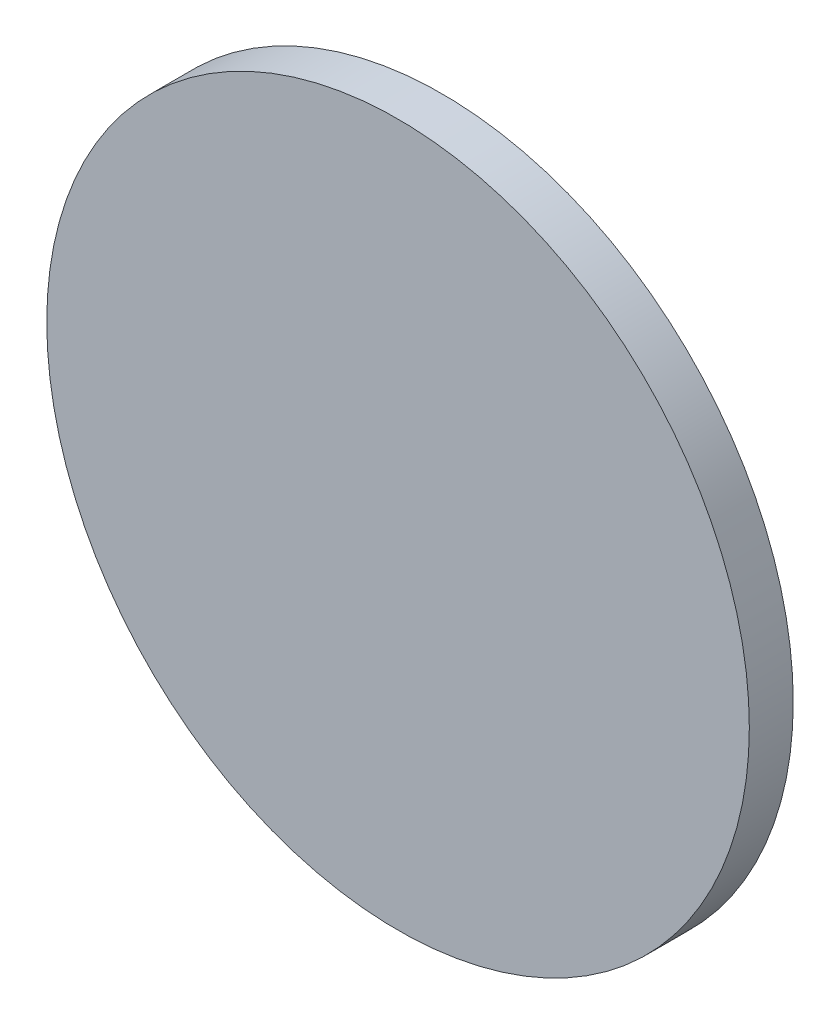
ISO-10303-21;
HEADER;
FILE_DESCRIPTION(('STEP AP214'),'2;1');
FILE_NAME('part.step','',(''),(''),'','','');
FILE_SCHEMA(('AUTOMOTIVE_DESIGN { 1 0 10303 214 1 1 1 1 }'));
ENDSEC;
DATA;
#1=APPLICATION_CONTEXT('core data for automotive mechanical design processes');
#2=APPLICATION_PROTOCOL_DEFINITION('international standard','automotive_design',2000,#1);
#3=PRODUCT_CONTEXT('',#1,'mechanical');
#4=PRODUCT('Part','Part','',(#3));
#5=PRODUCT_RELATED_PRODUCT_CATEGORY('part','',(#4));
#6=PRODUCT_DEFINITION_FORMATION('','',#4);
#7=PRODUCT_DEFINITION_CONTEXT('part definition',#1,'design');
#8=PRODUCT_DEFINITION('design','',#6,#7);
#9=PRODUCT_DEFINITION_SHAPE('','',#8);
#10=(LENGTH_UNIT() NAMED_UNIT(*) SI_UNIT(.MILLI.,.METRE.));
#11=(NAMED_UNIT(*) PLANE_ANGLE_UNIT() SI_UNIT($,.RADIAN.));
#12=(NAMED_UNIT(*) SI_UNIT($,.STERADIAN.) SOLID_ANGLE_UNIT());
#13=UNCERTAINTY_MEASURE_WITH_UNIT(LENGTH_MEASURE(1.E-05),#10,'distance_accuracy_value','');
#14=(GEOMETRIC_REPRESENTATION_CONTEXT(3) GLOBAL_UNCERTAINTY_ASSIGNED_CONTEXT((#13)) GLOBAL_UNIT_ASSIGNED_CONTEXT((#10,
#11,#12)) REPRESENTATION_CONTEXT('',''));
#15=CARTESIAN_POINT('',(0.,0.,0.));
#16=DIRECTION('',(0.,0.,1.));
#17=DIRECTION('',(1.,0.,0.));
#18=AXIS2_PLACEMENT_3D('',#15,#16,#17);
#19=CARTESIAN_POINT('',(0.,0.759664545437467,5.));
#20=DIRECTION('',(0.,0.,-1.));
#21=DIRECTION('',(-1.,0.,0.));
#22=AXIS2_PLACEMENT_3D('',#19,#20,#21);
#23=CYLINDRICAL_SURFACE('',#22,40.);
#24=CARTESIAN_POINT('',(0.,0.759664545437467,5.));
#25=DIRECTION('',(0.,0.,1.));
#26=DIRECTION('',(1.,0.,0.));
#27=AXIS2_PLACEMENT_3D('',#24,#25,#26);
#28=CIRCLE('',#27,40.);
#29=CARTESIAN_POINT('',(40.,0.759664545437467,5.));
#30=VERTEX_POINT('',#29);
#31=EDGE_CURVE('E11',#30,#30,#28,.T.);
#32=ORIENTED_EDGE('',*,*,#31,.F.);
#33=EDGE_LOOP('',(#32));
#34=FACE_BOUND('',#33,.T.);
#35=CARTESIAN_POINT('',(0.,0.759664545437467,0.));
#36=DIRECTION('',(0.,0.,1.));
#37=DIRECTION('',(1.,0.,0.));
#38=AXIS2_PLACEMENT_3D('',#35,#36,#37);
#39=CIRCLE('',#38,40.);
#40=CARTESIAN_POINT('',(40.,0.759664545437467,0.));
#41=VERTEX_POINT('',#40);
#42=EDGE_CURVE('E72',#41,#41,#39,.T.);
#43=ORIENTED_EDGE('',*,*,#42,.T.);
#44=EDGE_LOOP('',(#43));
#45=FACE_BOUND('',#44,.T.);
#46=ADVANCED_FACE('F69',(#34,#45),#23,.T.);
#47=CARTESIAN_POINT('',(0.,0.759664545437467,5.));
#48=DIRECTION('',(0.,0.,1.));
#49=DIRECTION('',(1.,0.,0.));
#50=AXIS2_PLACEMENT_3D('',#47,#48,#49);
#51=PLANE('',#50);
#52=ORIENTED_EDGE('',*,*,#31,.T.);
#53=EDGE_LOOP('',(#52));
#54=FACE_BOUND('',#53,.T.);
#55=ADVANCED_FACE('F124',(#54),#51,.T.);
#56=CARTESIAN_POINT('',(0.,0.759664545437467,0.));
#57=DIRECTION('',(0.,0.,1.));
#58=DIRECTION('',(1.,0.,0.));
#59=AXIS2_PLACEMENT_3D('',#56,#57,#58);
#60=PLANE('',#59);
#61=CARTESIAN_POINT('',(0.,0.759664545437467,0.));
#62=DIRECTION('',(0.,0.,1.));
#63=DIRECTION('',(1.,0.,0.));
#64=AXIS2_PLACEMENT_3D('',#61,#62,#63);
#65=CIRCLE('',#64,36.75);
#66=CARTESIAN_POINT('',(36.75,0.759664545437467,0.));
#67=VERTEX_POINT('',#66);
#68=EDGE_CURVE('E81',#67,#67,#65,.T.);
#69=ORIENTED_EDGE('',*,*,#68,.T.);
#70=EDGE_LOOP('',(#69));
#71=FACE_BOUND('',#70,.T.);
#72=ORIENTED_EDGE('',*,*,#42,.F.);
#73=EDGE_LOOP('',(#72));
#74=FACE_BOUND('',#73,.T.);
#75=ADVANCED_FACE('F129',(#71,#74),#60,.F.);
#76=CARTESIAN_POINT('',(0.,0.759664545437467,2.));
#77=DIRECTION('',(0.,0.,1.));
#78=DIRECTION('',(1.,0.,0.));
#79=AXIS2_PLACEMENT_3D('',#76,#77,#78);
#80=PLANE('',#79);
#81=CARTESIAN_POINT('',(0.,0.759664545437467,2.));
#82=DIRECTION('',(0.,0.,1.));
#83=DIRECTION('',(1.,0.,0.));
#84=AXIS2_PLACEMENT_3D('',#81,#82,#83);
#85=CIRCLE('',#84,36.75);
#86=CARTESIAN_POINT('',(36.75,0.759664545437467,2.));
#87=VERTEX_POINT('',#86);
#88=EDGE_CURVE('E79',#87,#87,#85,.T.);
#89=ORIENTED_EDGE('',*,*,#88,.F.);
#90=EDGE_LOOP('',(#89));
#91=FACE_BOUND('',#90,.T.);
#92=CARTESIAN_POINT('',(0.,0.,2.));
#93=DIRECTION('',(0.,0.,1.));
#94=DIRECTION('',(1.,0.,0.));
#95=AXIS2_PLACEMENT_3D('',#92,#93,#94);
#96=CIRCLE('',#95,29.25);
#97=CARTESIAN_POINT('',(29.25,0.,2.));
#98=VERTEX_POINT('',#97);
#99=EDGE_CURVE('E84',#98,#98,#96,.T.);
#100=ORIENTED_EDGE('',*,*,#99,.T.);
#101=EDGE_LOOP('',(#100));
#102=FACE_BOUND('',#101,.T.);
#103=ADVANCED_FACE('F135',(#91,#102),#80,.F.);
#104=CARTESIAN_POINT('',(0.,0.759664545437467,2.));
#105=DIRECTION('',(0.,0.,-1.));
#106=DIRECTION('',(-1.,0.,0.));
#107=AXIS2_PLACEMENT_3D('',#104,#105,#106);
#108=CYLINDRICAL_SURFACE('',#107,36.75);
#109=ORIENTED_EDGE('',*,*,#88,.T.);
#110=EDGE_LOOP('',(#109));
#111=FACE_BOUND('',#110,.T.);
#112=ORIENTED_EDGE('',*,*,#68,.F.);
#113=EDGE_LOOP('',(#112));
#114=FACE_BOUND('',#113,.T.);
#115=ADVANCED_FACE('F140',(#111,#114),#108,.F.);
#116=CARTESIAN_POINT('',(0.,0.,2.));
#117=DIRECTION('',(0.,0.,-1.));
#118=DIRECTION('',(-1.,0.,0.));
#119=AXIS2_PLACEMENT_3D('',#116,#117,#118);
#120=CYLINDRICAL_SURFACE('',#119,29.25);
#121=ORIENTED_EDGE('',*,*,#99,.F.);
#122=EDGE_LOOP('',(#121));
#123=FACE_BOUND('',#122,.T.);
#124=CARTESIAN_POINT('',(0.,0.,0.));
#125=DIRECTION('',(0.,0.,1.));
#126=DIRECTION('',(1.,0.,0.));
#127=AXIS2_PLACEMENT_3D('',#124,#125,#126);
#128=CIRCLE('',#127,29.25);
#129=CARTESIAN_POINT('',(29.25,0.,0.));
#130=VERTEX_POINT('',#129);
#131=EDGE_CURVE('E87',#130,#130,#128,.T.);
#132=ORIENTED_EDGE('',*,*,#131,.T.);
#133=EDGE_LOOP('',(#132));
#134=FACE_BOUND('',#133,.T.);
#135=ADVANCED_FACE('F146',(#123,#134),#120,.T.);
#136=CARTESIAN_POINT('',(0.,0.,0.));
#137=DIRECTION('',(0.,0.,1.));
#138=DIRECTION('',(1.,0.,0.));
#139=AXIS2_PLACEMENT_3D('',#136,#137,#138);
#140=CIRCLE('',#139,24.75);
#141=CARTESIAN_POINT('',(24.75,0.,0.));
#142=VERTEX_POINT('',#141);
#143=EDGE_CURVE('E96',#142,#142,#140,.T.);
#144=ORIENTED_EDGE('',*,*,#143,.T.);
#145=EDGE_LOOP('',(#144));
#146=FACE_BOUND('',#145,.T.);
#147=ORIENTED_EDGE('',*,*,#131,.F.);
#148=EDGE_LOOP('',(#147));
#149=FACE_BOUND('',#148,.T.);
#150=ADVANCED_FACE('F105',(#146,#149),#60,.F.);
#151=CARTESIAN_POINT('',(0.,0.,2.));
#152=DIRECTION('',(0.,0.,1.));
#153=DIRECTION('',(1.,0.,0.));
#154=AXIS2_PLACEMENT_3D('',#151,#152,#153);
#155=PLANE('',#154);
#156=CARTESIAN_POINT('',(0.,0.,2.));
#157=DIRECTION('',(0.,0.,1.));
#158=DIRECTION('',(1.,0.,0.));
#159=AXIS2_PLACEMENT_3D('',#156,#157,#158);
#160=CIRCLE('',#159,24.75);
#161=CARTESIAN_POINT('',(24.75,0.,2.));
#162=VERTEX_POINT('',#161);
#163=EDGE_CURVE('E99',#162,#162,#160,.T.);
#164=ORIENTED_EDGE('',*,*,#163,.F.);
#165=EDGE_LOOP('',(#164));
#166=FACE_BOUND('',#165,.T.);
#167=CARTESIAN_POINT('',(0.,0.,2.));
#168=DIRECTION('',(0.,0.,1.));
#169=DIRECTION('',(1.,0.,0.));
#170=AXIS2_PLACEMENT_3D('',#167,#168,#169);
#171=CIRCLE('',#170,23.25);
#172=CARTESIAN_POINT('',(23.25,0.,2.));
#173=VERTEX_POINT('',#172);
#174=EDGE_CURVE('E93',#173,#173,#171,.T.);
#175=ORIENTED_EDGE('',*,*,#174,.T.);
#176=EDGE_LOOP('',(#175));
#177=FACE_BOUND('',#176,.T.);
#178=ADVANCED_FACE('F111',(#166,#177),#155,.F.);
#179=CARTESIAN_POINT('',(0.,0.,2.));
#180=DIRECTION('',(0.,0.,-1.));
#181=DIRECTION('',(-1.,0.,0.));
#182=AXIS2_PLACEMENT_3D('',#179,#180,#181);
#183=CYLINDRICAL_SURFACE('',#182,24.75);
#184=ORIENTED_EDGE('',*,*,#163,.T.);
#185=EDGE_LOOP('',(#184));
#186=FACE_BOUND('',#185,.T.);
#187=ORIENTED_EDGE('',*,*,#143,.F.);
#188=EDGE_LOOP('',(#187));
#189=FACE_BOUND('',#188,.T.);
#190=ADVANCED_FACE('F108',(#186,#189),#183,.F.);
#191=CARTESIAN_POINT('',(0.,0.,2.));
#192=DIRECTION('',(0.,0.,-1.));
#193=DIRECTION('',(-1.,0.,0.));
#194=AXIS2_PLACEMENT_3D('',#191,#192,#193);
#195=CYLINDRICAL_SURFACE('',#194,23.25);
#196=ORIENTED_EDGE('',*,*,#174,.F.);
#197=EDGE_LOOP('',(#196));
#198=FACE_BOUND('',#197,.T.);
#199=CARTESIAN_POINT('',(0.,0.,0.));
#200=DIRECTION('',(0.,0.,1.));
#201=DIRECTION('',(1.,0.,0.));
#202=AXIS2_PLACEMENT_3D('',#199,#200,#201);
#203=CIRCLE('',#202,23.25);
#204=CARTESIAN_POINT('',(23.25,0.,0.));
#205=VERTEX_POINT('',#204);
#206=EDGE_CURVE('E90',#205,#205,#203,.T.);
#207=ORIENTED_EDGE('',*,*,#206,.T.);
#208=EDGE_LOOP('',(#207));
#209=FACE_BOUND('',#208,.T.);
#210=ADVANCED_FACE('F110',(#198,#209),#195,.T.);
#211=ORIENTED_EDGE('',*,*,#206,.F.);
#212=EDGE_LOOP('',(#211));
#213=FACE_BOUND('',#212,.T.);
#214=ADVANCED_FACE('F118',(#213),#60,.F.);
#215=CLOSED_SHELL('',(#46,#55,#75,#103,#115,#135,#150,#178,#190,#210,#214));
#216=MANIFOLD_SOLID_BREP('B2',#215);
#217=ADVANCED_BREP_SHAPE_REPRESENTATION('',(#18,#216),#14);
#218=SHAPE_DEFINITION_REPRESENTATION(#9,#217);
ENDSEC;
END-ISO-10303-21;
